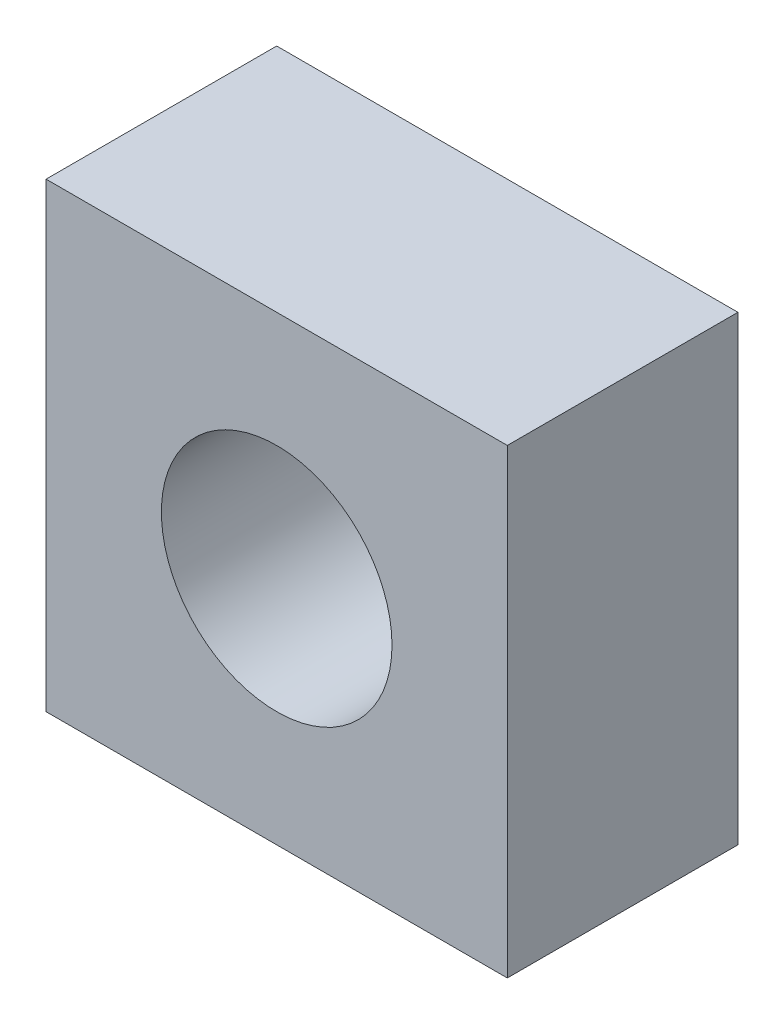
ISO-10303-21;
HEADER;
FILE_DESCRIPTION(('STEP AP214'),'2;1');
FILE_NAME('part.step','',(''),(''),'','','');
FILE_SCHEMA(('AUTOMOTIVE_DESIGN { 1 0 10303 214 1 1 1 1 }'));
ENDSEC;
DATA;
#1=APPLICATION_CONTEXT('core data for automotive mechanical design processes');
#2=APPLICATION_PROTOCOL_DEFINITION('international standard','automotive_design',2000,#1);
#3=PRODUCT_CONTEXT('',#1,'mechanical');
#4=PRODUCT('Part','Part','',(#3));
#5=PRODUCT_RELATED_PRODUCT_CATEGORY('part','',(#4));
#6=PRODUCT_DEFINITION_FORMATION('','',#4);
#7=PRODUCT_DEFINITION_CONTEXT('part definition',#1,'design');
#8=PRODUCT_DEFINITION('design','',#6,#7);
#9=PRODUCT_DEFINITION_SHAPE('','',#8);
#10=(LENGTH_UNIT() NAMED_UNIT(*) SI_UNIT(.MILLI.,.METRE.));
#11=(NAMED_UNIT(*) PLANE_ANGLE_UNIT() SI_UNIT($,.RADIAN.));
#12=(NAMED_UNIT(*) SI_UNIT($,.STERADIAN.) SOLID_ANGLE_UNIT());
#13=UNCERTAINTY_MEASURE_WITH_UNIT(LENGTH_MEASURE(1.E-05),#10,'distance_accuracy_value','');
#14=(GEOMETRIC_REPRESENTATION_CONTEXT(3) GLOBAL_UNCERTAINTY_ASSIGNED_CONTEXT((#13)) GLOBAL_UNIT_ASSIGNED_CONTEXT((#10,
#11,#12)) REPRESENTATION_CONTEXT('',''));
#15=CARTESIAN_POINT('',(0.,0.,0.));
#16=DIRECTION('',(0.,0.,1.));
#17=DIRECTION('',(1.,0.,0.));
#18=AXIS2_PLACEMENT_3D('',#15,#16,#17);
#19=CARTESIAN_POINT('',(0.,0.,20.));
#20=DIRECTION('',(0.,0.,-1.));
#21=DIRECTION('',(-1.,0.,0.));
#22=AXIS2_PLACEMENT_3D('',#19,#20,#21);
#23=PLANE('',#22);
#24=DIRECTION('',(0.,-1.,0.));
#25=VECTOR('',#24,1.);
#26=CARTESIAN_POINT('',(0.,0.,20.));
#27=LINE('',#26,#25);
#28=CARTESIAN_POINT('',(0.,40.,20.));
#29=VERTEX_POINT('',#28);
#30=CARTESIAN_POINT('',(0.,0.,20.));
#31=VERTEX_POINT('',#30);
#32=EDGE_CURVE('E91',#29,#31,#27,.T.);
#33=ORIENTED_EDGE('',*,*,#32,.T.);
#34=DIRECTION('',(1.,0.,0.));
#35=VECTOR('',#34,1.);
#36=CARTESIAN_POINT('',(0.,0.,20.));
#37=LINE('',#36,#35);
#38=CARTESIAN_POINT('',(40.,0.,20.));
#39=VERTEX_POINT('',#38);
#40=EDGE_CURVE('E86',#31,#39,#37,.T.);
#41=ORIENTED_EDGE('',*,*,#40,.T.);
#42=DIRECTION('',(0.,1.,0.));
#43=VECTOR('',#42,1.);
#44=CARTESIAN_POINT('',(40.,0.,20.));
#45=LINE('',#44,#43);
#46=CARTESIAN_POINT('',(40.,40.,20.));
#47=VERTEX_POINT('',#46);
#48=EDGE_CURVE('E87',#39,#47,#45,.T.);
#49=ORIENTED_EDGE('',*,*,#48,.T.);
#50=DIRECTION('',(-1.,0.,0.));
#51=VECTOR('',#50,1.);
#52=CARTESIAN_POINT('',(0.,40.,20.));
#53=LINE('',#52,#51);
#54=EDGE_CURVE('E57',#47,#29,#53,.T.);
#55=ORIENTED_EDGE('',*,*,#54,.T.);
#56=EDGE_LOOP('',(#33,#41,#49,#55));
#57=FACE_BOUND('',#56,.T.);
#58=CARTESIAN_POINT('',(20.,20.,20.));
#59=DIRECTION('',(0.,0.,1.));
#60=DIRECTION('',(1.,0.,0.));
#61=AXIS2_PLACEMENT_3D('',#58,#59,#60);
#62=CIRCLE('',#61,10.);
#63=CARTESIAN_POINT('',(30.,20.,20.));
#64=VERTEX_POINT('',#63);
#65=EDGE_CURVE('E106',#64,#64,#62,.T.);
#66=ORIENTED_EDGE('',*,*,#65,.F.);
#67=EDGE_LOOP('',(#66));
#68=FACE_BOUND('',#67,.T.);
#69=ADVANCED_FACE('F39',(#57,#68),#23,.F.);
#70=CARTESIAN_POINT('',(0.,0.,0.));
#71=DIRECTION('',(0.,0.,-1.));
#72=DIRECTION('',(-1.,0.,0.));
#73=AXIS2_PLACEMENT_3D('',#70,#71,#72);
#74=PLANE('',#73);
#75=DIRECTION('',(0.,-1.,0.));
#76=VECTOR('',#75,1.);
#77=CARTESIAN_POINT('',(0.,0.,0.));
#78=LINE('',#77,#76);
#79=CARTESIAN_POINT('',(0.,40.,0.));
#80=VERTEX_POINT('',#79);
#81=CARTESIAN_POINT('',(0.,0.,0.));
#82=VERTEX_POINT('',#81);
#83=EDGE_CURVE('E104',#80,#82,#78,.T.);
#84=ORIENTED_EDGE('',*,*,#83,.F.);
#85=DIRECTION('',(-1.,0.,0.));
#86=VECTOR('',#85,1.);
#87=CARTESIAN_POINT('',(0.,40.,0.));
#88=LINE('',#87,#86);
#89=CARTESIAN_POINT('',(40.,40.,0.));
#90=VERTEX_POINT('',#89);
#91=EDGE_CURVE('E80',#90,#80,#88,.T.);
#92=ORIENTED_EDGE('',*,*,#91,.F.);
#93=DIRECTION('',(0.,1.,0.));
#94=VECTOR('',#93,1.);
#95=CARTESIAN_POINT('',(40.,0.,0.));
#96=LINE('',#95,#94);
#97=CARTESIAN_POINT('',(40.,0.,0.));
#98=VERTEX_POINT('',#97);
#99=EDGE_CURVE('E74',#98,#90,#96,.T.);
#100=ORIENTED_EDGE('',*,*,#99,.F.);
#101=DIRECTION('',(1.,0.,0.));
#102=VECTOR('',#101,1.);
#103=CARTESIAN_POINT('',(0.,0.,0.));
#104=LINE('',#103,#102);
#105=EDGE_CURVE('E94',#82,#98,#104,.T.);
#106=ORIENTED_EDGE('',*,*,#105,.F.);
#107=EDGE_LOOP('',(#84,#92,#100,#106));
#108=FACE_BOUND('',#107,.T.);
#109=CARTESIAN_POINT('',(20.,20.,0.));
#110=DIRECTION('',(0.,0.,1.));
#111=DIRECTION('',(1.,0.,0.));
#112=AXIS2_PLACEMENT_3D('',#109,#110,#111);
#113=CIRCLE('',#112,10.);
#114=CARTESIAN_POINT('',(30.,20.,0.));
#115=VERTEX_POINT('',#114);
#116=EDGE_CURVE('E119',#115,#115,#113,.T.);
#117=ORIENTED_EDGE('',*,*,#116,.T.);
#118=EDGE_LOOP('',(#117));
#119=FACE_BOUND('',#118,.T.);
#120=ADVANCED_FACE('F114',(#108,#119),#74,.T.);
#121=CARTESIAN_POINT('',(0.,0.,20.));
#122=DIRECTION('',(1.,0.,0.));
#123=DIRECTION('',(0.,0.,-1.));
#124=AXIS2_PLACEMENT_3D('',#121,#122,#123);
#125=PLANE('',#124);
#126=ORIENTED_EDGE('',*,*,#83,.T.);
#127=DIRECTION('',(0.,0.,-1.));
#128=VECTOR('',#127,1.);
#129=CARTESIAN_POINT('',(0.,0.,20.));
#130=LINE('',#129,#128);
#131=EDGE_CURVE('E11',#31,#82,#130,.T.);
#132=ORIENTED_EDGE('',*,*,#131,.F.);
#133=ORIENTED_EDGE('',*,*,#32,.F.);
#134=DIRECTION('',(0.,0.,-1.));
#135=VECTOR('',#134,1.);
#136=CARTESIAN_POINT('',(0.,40.,20.));
#137=LINE('',#136,#135);
#138=EDGE_CURVE('E98',#29,#80,#137,.T.);
#139=ORIENTED_EDGE('',*,*,#138,.T.);
#140=EDGE_LOOP('',(#126,#132,#133,#139));
#141=FACE_BOUND('',#140,.T.);
#142=ADVANCED_FACE('F41',(#141),#125,.F.);
#143=CARTESIAN_POINT('',(0.,0.,20.));
#144=DIRECTION('',(0.,1.,0.));
#145=DIRECTION('',(0.,0.,1.));
#146=AXIS2_PLACEMENT_3D('',#143,#144,#145);
#147=PLANE('',#146);
#148=ORIENTED_EDGE('',*,*,#105,.T.);
#149=DIRECTION('',(0.,0.,-1.));
#150=VECTOR('',#149,1.);
#151=CARTESIAN_POINT('',(40.,0.,20.));
#152=LINE('',#151,#150);
#153=EDGE_CURVE('E48',#39,#98,#152,.T.);
#154=ORIENTED_EDGE('',*,*,#153,.F.);
#155=ORIENTED_EDGE('',*,*,#40,.F.);
#156=ORIENTED_EDGE('',*,*,#131,.T.);
#157=EDGE_LOOP('',(#148,#154,#155,#156));
#158=FACE_BOUND('',#157,.T.);
#159=ADVANCED_FACE('F92',(#158),#147,.F.);
#160=CARTESIAN_POINT('',(40.,0.,20.));
#161=DIRECTION('',(-1.,0.,0.));
#162=DIRECTION('',(0.,0.,1.));
#163=AXIS2_PLACEMENT_3D('',#160,#161,#162);
#164=PLANE('',#163);
#165=ORIENTED_EDGE('',*,*,#99,.T.);
#166=DIRECTION('',(0.,0.,-1.));
#167=VECTOR('',#166,1.);
#168=CARTESIAN_POINT('',(40.,40.,20.));
#169=LINE('',#168,#167);
#170=EDGE_CURVE('E96',#47,#90,#169,.T.);
#171=ORIENTED_EDGE('',*,*,#170,.F.);
#172=ORIENTED_EDGE('',*,*,#48,.F.);
#173=ORIENTED_EDGE('',*,*,#153,.T.);
#174=EDGE_LOOP('',(#165,#171,#172,#173));
#175=FACE_BOUND('',#174,.T.);
#176=ADVANCED_FACE('F100',(#175),#164,.F.);
#177=CARTESIAN_POINT('',(0.,40.,20.));
#178=DIRECTION('',(0.,-1.,0.));
#179=DIRECTION('',(0.,0.,-1.));
#180=AXIS2_PLACEMENT_3D('',#177,#178,#179);
#181=PLANE('',#180);
#182=ORIENTED_EDGE('',*,*,#91,.T.);
#183=ORIENTED_EDGE('',*,*,#138,.F.);
#184=ORIENTED_EDGE('',*,*,#54,.F.);
#185=ORIENTED_EDGE('',*,*,#170,.T.);
#186=EDGE_LOOP('',(#182,#183,#184,#185));
#187=FACE_BOUND('',#186,.T.);
#188=ADVANCED_FACE('F112',(#187),#181,.F.);
#189=CARTESIAN_POINT('',(20.,20.,20.));
#190=DIRECTION('',(0.,0.,-1.));
#191=DIRECTION('',(-1.,0.,0.));
#192=AXIS2_PLACEMENT_3D('',#189,#190,#191);
#193=CYLINDRICAL_SURFACE('',#192,10.);
#194=ORIENTED_EDGE('',*,*,#65,.T.);
#195=EDGE_LOOP('',(#194));
#196=FACE_BOUND('',#195,.T.);
#197=ORIENTED_EDGE('',*,*,#116,.F.);
#198=EDGE_LOOP('',(#197));
#199=FACE_BOUND('',#198,.T.);
#200=ADVANCED_FACE('F125',(#196,#199),#193,.F.);
#201=CLOSED_SHELL('',(#69,#120,#142,#159,#176,#188,#200));
#202=MANIFOLD_SOLID_BREP('B2',#201);
#203=ADVANCED_BREP_SHAPE_REPRESENTATION('',(#18,#202),#14);
#204=SHAPE_DEFINITION_REPRESENTATION(#9,#203);
ENDSEC;
END-ISO-10303-21;
